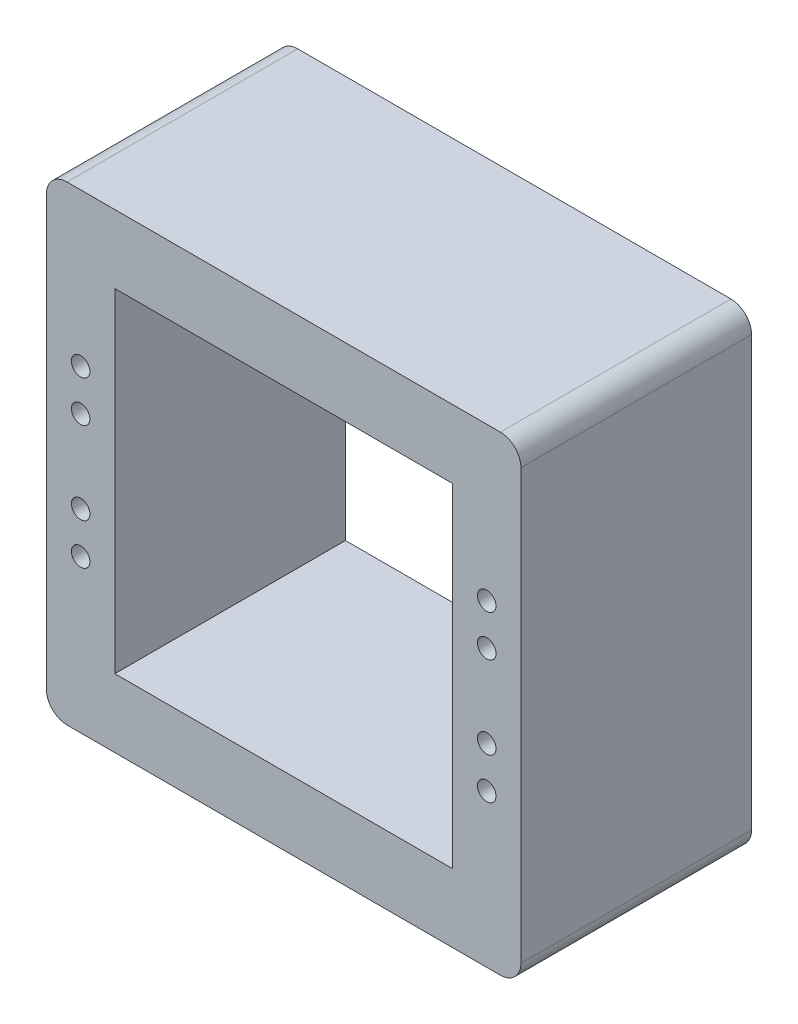
ISO-10303-21;
HEADER;
FILE_DESCRIPTION(('STEP AP214'),'2;1');
FILE_NAME('part.step','',(''),(''),'','','');
FILE_SCHEMA(('AUTOMOTIVE_DESIGN { 1 0 10303 214 1 1 1 1 }'));
ENDSEC;
DATA;
#1=APPLICATION_CONTEXT('core data for automotive mechanical design processes');
#2=APPLICATION_PROTOCOL_DEFINITION('international standard','automotive_design',2000,#1);
#3=PRODUCT_CONTEXT('',#1,'mechanical');
#4=PRODUCT('Part','Part','',(#3));
#5=PRODUCT_RELATED_PRODUCT_CATEGORY('part','',(#4));
#6=PRODUCT_DEFINITION_FORMATION('','',#4);
#7=PRODUCT_DEFINITION_CONTEXT('part definition',#1,'design');
#8=PRODUCT_DEFINITION('design','',#6,#7);
#9=PRODUCT_DEFINITION_SHAPE('','',#8);
#10=(LENGTH_UNIT() NAMED_UNIT(*) SI_UNIT(.MILLI.,.METRE.));
#11=(NAMED_UNIT(*) PLANE_ANGLE_UNIT() SI_UNIT($,.RADIAN.));
#12=(NAMED_UNIT(*) SI_UNIT($,.STERADIAN.) SOLID_ANGLE_UNIT());
#13=UNCERTAINTY_MEASURE_WITH_UNIT(LENGTH_MEASURE(1.E-05),#10,'distance_accuracy_value','');
#14=(GEOMETRIC_REPRESENTATION_CONTEXT(3) GLOBAL_UNCERTAINTY_ASSIGNED_CONTEXT((#13)) GLOBAL_UNIT_ASSIGNED_CONTEXT((#10,
#11,#12)) REPRESENTATION_CONTEXT('',''));
#15=CARTESIAN_POINT('',(0.,0.,0.));
#16=DIRECTION('',(0.,0.,1.));
#17=DIRECTION('',(1.,0.,0.));
#18=AXIS2_PLACEMENT_3D('',#15,#16,#17);
#19=CARTESIAN_POINT('',(0.,0.,28.));
#20=DIRECTION('',(0.,0.,-1.));
#21=DIRECTION('',(-1.,0.,0.));
#22=AXIS2_PLACEMENT_3D('',#19,#20,#21);
#23=PLANE('',#22);
#24=DIRECTION('',(0.,1.,0.));
#25=VECTOR('',#24,1.);
#26=CARTESIAN_POINT('',(49.3,-8.3,28.));
#27=LINE('',#26,#25);
#28=CARTESIAN_POINT('',(49.3,-5.8,28.));
#29=VERTEX_POINT('',#28);
#30=CARTESIAN_POINT('',(49.3,46.3,28.));
#31=VERTEX_POINT('',#30);
#32=EDGE_CURVE('E179',#29,#31,#27,.T.);
#33=ORIENTED_EDGE('',*,*,#32,.T.);
#34=CARTESIAN_POINT('',(46.8,46.3,28.));
#35=DIRECTION('',(0.,0.,-1.));
#36=DIRECTION('',(-1.,0.,0.));
#37=AXIS2_PLACEMENT_3D('',#34,#35,#36);
#38=CIRCLE('',#37,2.5);
#39=CARTESIAN_POINT('',(46.8,48.8,28.));
#40=VERTEX_POINT('',#39);
#41=EDGE_CURVE('E217',#31,#40,#38,.F.);
#42=ORIENTED_EDGE('',*,*,#41,.T.);
#43=DIRECTION('',(-1.,0.,0.));
#44=VECTOR('',#43,1.);
#45=CARTESIAN_POINT('',(-8.3,48.8,28.));
#46=LINE('',#45,#44);
#47=CARTESIAN_POINT('',(-5.8,48.8,28.));
#48=VERTEX_POINT('',#47);
#49=EDGE_CURVE('E182',#40,#48,#46,.T.);
#50=ORIENTED_EDGE('',*,*,#49,.T.);
#51=CARTESIAN_POINT('',(-5.8,46.3,28.));
#52=DIRECTION('',(0.,0.,-1.));
#53=DIRECTION('',(-1.,0.,0.));
#54=AXIS2_PLACEMENT_3D('',#51,#52,#53);
#55=CIRCLE('',#54,2.5);
#56=CARTESIAN_POINT('',(-8.3,46.3,28.));
#57=VERTEX_POINT('',#56);
#58=EDGE_CURVE('E212',#48,#57,#55,.F.);
#59=ORIENTED_EDGE('',*,*,#58,.T.);
#60=DIRECTION('',(0.,-1.,0.));
#61=VECTOR('',#60,1.);
#62=CARTESIAN_POINT('',(-8.3,-8.3,28.));
#63=LINE('',#62,#61);
#64=CARTESIAN_POINT('',(-8.3,-5.8,28.));
#65=VERTEX_POINT('',#64);
#66=EDGE_CURVE('E174',#57,#65,#63,.T.);
#67=ORIENTED_EDGE('',*,*,#66,.T.);
#68=CARTESIAN_POINT('',(-5.8,-5.8,28.));
#69=DIRECTION('',(0.,0.,-1.));
#70=DIRECTION('',(-1.,0.,0.));
#71=AXIS2_PLACEMENT_3D('',#68,#69,#70);
#72=CIRCLE('',#71,2.5);
#73=CARTESIAN_POINT('',(-5.8,-8.3,28.));
#74=VERTEX_POINT('',#73);
#75=EDGE_CURVE('E61',#65,#74,#72,.F.);
#76=ORIENTED_EDGE('',*,*,#75,.T.);
#77=DIRECTION('',(1.,0.,0.));
#78=VECTOR('',#77,1.);
#79=CARTESIAN_POINT('',(-8.3,-8.3,28.));
#80=LINE('',#79,#78);
#81=CARTESIAN_POINT('',(46.8,-8.3,28.));
#82=VERTEX_POINT('',#81);
#83=EDGE_CURVE('E176',#74,#82,#80,.T.);
#84=ORIENTED_EDGE('',*,*,#83,.T.);
#85=CARTESIAN_POINT('',(46.8,-5.8,28.));
#86=DIRECTION('',(0.,0.,-1.));
#87=DIRECTION('',(-1.,0.,0.));
#88=AXIS2_PLACEMENT_3D('',#85,#86,#87);
#89=CIRCLE('',#88,2.5);
#90=EDGE_CURVE('E215',#82,#29,#89,.F.);
#91=ORIENTED_EDGE('',*,*,#90,.T.);
#92=EDGE_LOOP('',(#33,#42,#50,#59,#67,#76,#84,#91));
#93=FACE_BOUND('',#92,.T.);
#94=DIRECTION('',(0.,-1.,0.));
#95=VECTOR('',#94,1.);
#96=CARTESIAN_POINT('',(0.,0.,28.));
#97=LINE('',#96,#95);
#98=CARTESIAN_POINT('',(0.,40.5,28.));
#99=VERTEX_POINT('',#98);
#100=CARTESIAN_POINT('',(0.,0.,28.));
#101=VERTEX_POINT('',#100);
#102=EDGE_CURVE('E130',#99,#101,#97,.T.);
#103=ORIENTED_EDGE('',*,*,#102,.F.);
#104=DIRECTION('',(-1.,0.,0.));
#105=VECTOR('',#104,1.);
#106=CARTESIAN_POINT('',(0.,40.5,28.));
#107=LINE('',#106,#105);
#108=CARTESIAN_POINT('',(41.,40.5,28.));
#109=VERTEX_POINT('',#108);
#110=EDGE_CURVE('E156',#109,#99,#107,.T.);
#111=ORIENTED_EDGE('',*,*,#110,.F.);
#112=DIRECTION('',(0.,1.,0.));
#113=VECTOR('',#112,1.);
#114=CARTESIAN_POINT('',(41.,0.,28.));
#115=LINE('',#114,#113);
#116=CARTESIAN_POINT('',(41.,0.,28.));
#117=VERTEX_POINT('',#116);
#118=EDGE_CURVE('E154',#117,#109,#115,.T.);
#119=ORIENTED_EDGE('',*,*,#118,.F.);
#120=DIRECTION('',(1.,0.,0.));
#121=VECTOR('',#120,1.);
#122=CARTESIAN_POINT('',(0.,0.,28.));
#123=LINE('',#122,#121);
#124=EDGE_CURVE('E140',#101,#117,#123,.T.);
#125=ORIENTED_EDGE('',*,*,#124,.F.);
#126=EDGE_LOOP('',(#103,#111,#119,#125));
#127=FACE_BOUND('',#126,.T.);
#128=CARTESIAN_POINT('',(-4.15,25.25,28.));
#129=DIRECTION('',(0.,0.,1.));
#130=DIRECTION('',(1.,0.,0.));
#131=AXIS2_PLACEMENT_3D('',#128,#129,#130);
#132=CIRCLE('',#131,1.125);
#133=CARTESIAN_POINT('',(-3.025,25.25,28.));
#134=VERTEX_POINT('',#133);
#135=EDGE_CURVE('E163',#134,#134,#132,.T.);
#136=ORIENTED_EDGE('',*,*,#135,.F.);
#137=EDGE_LOOP('',(#136));
#138=FACE_BOUND('',#137,.T.);
#139=CARTESIAN_POINT('',(-4.15,30.25,28.));
#140=DIRECTION('',(0.,0.,1.));
#141=DIRECTION('',(1.,0.,0.));
#142=AXIS2_PLACEMENT_3D('',#139,#140,#141);
#143=CIRCLE('',#142,1.125);
#144=CARTESIAN_POINT('',(-3.025,30.25,28.));
#145=VERTEX_POINT('',#144);
#146=EDGE_CURVE('E502',#145,#145,#143,.T.);
#147=ORIENTED_EDGE('',*,*,#146,.F.);
#148=EDGE_LOOP('',(#147));
#149=FACE_BOUND('',#148,.T.);
#150=CARTESIAN_POINT('',(-4.15000000000001,10.25,28.));
#151=DIRECTION('',(0.,0.,1.));
#152=DIRECTION('',(-1.,0.,0.));
#153=AXIS2_PLACEMENT_3D('',#150,#151,#152);
#154=CIRCLE('',#153,1.125);
#155=CARTESIAN_POINT('',(-5.275,10.25,28.));
#156=VERTEX_POINT('',#155);
#157=EDGE_CURVE('E497',#156,#156,#154,.T.);
#158=ORIENTED_EDGE('',*,*,#157,.F.);
#159=EDGE_LOOP('',(#158));
#160=FACE_BOUND('',#159,.T.);
#161=CARTESIAN_POINT('',(-4.15,15.25,28.));
#162=DIRECTION('',(0.,0.,1.));
#163=DIRECTION('',(-1.,0.,0.));
#164=AXIS2_PLACEMENT_3D('',#161,#162,#163);
#165=CIRCLE('',#164,1.125);
#166=CARTESIAN_POINT('',(-5.275,15.25,28.));
#167=VERTEX_POINT('',#166);
#168=EDGE_CURVE('E492',#167,#167,#165,.T.);
#169=ORIENTED_EDGE('',*,*,#168,.F.);
#170=EDGE_LOOP('',(#169));
#171=FACE_BOUND('',#170,.T.);
#172=CARTESIAN_POINT('',(45.15,15.25,28.));
#173=DIRECTION('',(0.,0.,1.));
#174=DIRECTION('',(1.,0.,0.));
#175=AXIS2_PLACEMENT_3D('',#172,#173,#174);
#176=CIRCLE('',#175,1.125);
#177=CARTESIAN_POINT('',(46.275,15.25,28.));
#178=VERTEX_POINT('',#177);
#179=EDGE_CURVE('E487',#178,#178,#176,.T.);
#180=ORIENTED_EDGE('',*,*,#179,.F.);
#181=EDGE_LOOP('',(#180));
#182=FACE_BOUND('',#181,.T.);
#183=CARTESIAN_POINT('',(45.15,10.25,28.));
#184=DIRECTION('',(0.,0.,1.));
#185=DIRECTION('',(1.,0.,0.));
#186=AXIS2_PLACEMENT_3D('',#183,#184,#185);
#187=CIRCLE('',#186,1.12499999999999);
#188=CARTESIAN_POINT('',(46.275,10.25,28.));
#189=VERTEX_POINT('',#188);
#190=EDGE_CURVE('E482',#189,#189,#187,.T.);
#191=ORIENTED_EDGE('',*,*,#190,.F.);
#192=EDGE_LOOP('',(#191));
#193=FACE_BOUND('',#192,.T.);
#194=CARTESIAN_POINT('',(45.15,30.25,28.));
#195=DIRECTION('',(0.,0.,1.));
#196=DIRECTION('',(-1.,0.,0.));
#197=AXIS2_PLACEMENT_3D('',#194,#195,#196);
#198=CIRCLE('',#197,1.125);
#199=CARTESIAN_POINT('',(44.025,30.25,28.));
#200=VERTEX_POINT('',#199);
#201=EDGE_CURVE('E477',#200,#200,#198,.T.);
#202=ORIENTED_EDGE('',*,*,#201,.F.);
#203=EDGE_LOOP('',(#202));
#204=FACE_BOUND('',#203,.T.);
#205=CARTESIAN_POINT('',(45.15,25.25,28.));
#206=DIRECTION('',(0.,0.,1.));
#207=DIRECTION('',(-1.,0.,0.));
#208=AXIS2_PLACEMENT_3D('',#205,#206,#207);
#209=CIRCLE('',#208,1.125);
#210=CARTESIAN_POINT('',(44.025,25.25,28.));
#211=VERTEX_POINT('',#210);
#212=EDGE_CURVE('E471',#211,#211,#209,.T.);
#213=ORIENTED_EDGE('',*,*,#212,.F.);
#214=EDGE_LOOP('',(#213));
#215=FACE_BOUND('',#214,.T.);
#216=ADVANCED_FACE('F39',(#93,#127,#138,#149,#160,#171,#182,#193,#204,#215),#23,.F.);
#217=CARTESIAN_POINT('',(0.,0.,0.));
#218=DIRECTION('',(0.,0.,-1.));
#219=DIRECTION('',(-1.,0.,0.));
#220=AXIS2_PLACEMENT_3D('',#217,#218,#219);
#221=PLANE('',#220);
#222=CARTESIAN_POINT('',(45.15,30.25,0.));
#223=DIRECTION('',(0.,0.,1.));
#224=DIRECTION('',(-1.,0.,0.));
#225=AXIS2_PLACEMENT_3D('',#222,#223,#224);
#226=CIRCLE('',#225,1.125);
#227=CARTESIAN_POINT('',(44.025,30.25,0.));
#228=VERTEX_POINT('',#227);
#229=EDGE_CURVE('E474',#228,#228,#226,.T.);
#230=ORIENTED_EDGE('',*,*,#229,.T.);
#231=EDGE_LOOP('',(#230));
#232=FACE_BOUND('',#231,.T.);
#233=CARTESIAN_POINT('',(45.15,15.25,0.));
#234=DIRECTION('',(0.,0.,1.));
#235=DIRECTION('',(1.,0.,0.));
#236=AXIS2_PLACEMENT_3D('',#233,#234,#235);
#237=CIRCLE('',#236,1.125);
#238=CARTESIAN_POINT('',(46.275,15.25,0.));
#239=VERTEX_POINT('',#238);
#240=EDGE_CURVE('E485',#239,#239,#237,.T.);
#241=ORIENTED_EDGE('',*,*,#240,.T.);
#242=EDGE_LOOP('',(#241));
#243=FACE_BOUND('',#242,.T.);
#244=CARTESIAN_POINT('',(-4.15000000000001,10.25,0.));
#245=DIRECTION('',(0.,0.,1.));
#246=DIRECTION('',(-1.,0.,0.));
#247=AXIS2_PLACEMENT_3D('',#244,#245,#246);
#248=CIRCLE('',#247,1.125);
#249=CARTESIAN_POINT('',(-5.275,10.25,0.));
#250=VERTEX_POINT('',#249);
#251=EDGE_CURVE('E495',#250,#250,#248,.T.);
#252=ORIENTED_EDGE('',*,*,#251,.T.);
#253=EDGE_LOOP('',(#252));
#254=FACE_BOUND('',#253,.T.);
#255=CARTESIAN_POINT('',(-4.15,25.25,0.));
#256=DIRECTION('',(0.,0.,1.));
#257=DIRECTION('',(1.,0.,0.));
#258=AXIS2_PLACEMENT_3D('',#255,#256,#257);
#259=CIRCLE('',#258,1.125);
#260=CARTESIAN_POINT('',(-3.025,25.25,0.));
#261=VERTEX_POINT('',#260);
#262=EDGE_CURVE('E505',#261,#261,#259,.T.);
#263=ORIENTED_EDGE('',*,*,#262,.T.);
#264=EDGE_LOOP('',(#263));
#265=FACE_BOUND('',#264,.T.);
#266=DIRECTION('',(-1.,0.,0.));
#267=VECTOR('',#266,1.);
#268=CARTESIAN_POINT('',(-8.3,48.8,0.));
#269=LINE('',#268,#267);
#270=CARTESIAN_POINT('',(46.8,48.8,0.));
#271=VERTEX_POINT('',#270);
#272=CARTESIAN_POINT('',(-5.8,48.8,0.));
#273=VERTEX_POINT('',#272);
#274=EDGE_CURVE('E177',#271,#273,#269,.T.);
#275=ORIENTED_EDGE('',*,*,#274,.F.);
#276=CARTESIAN_POINT('',(46.8,46.3,0.));
#277=DIRECTION('',(0.,0.,-1.));
#278=DIRECTION('',(-1.,0.,0.));
#279=AXIS2_PLACEMENT_3D('',#276,#277,#278);
#280=CIRCLE('',#279,2.5);
#281=CARTESIAN_POINT('',(49.3,46.3,0.));
#282=VERTEX_POINT('',#281);
#283=EDGE_CURVE('E205',#271,#282,#280,.T.);
#284=ORIENTED_EDGE('',*,*,#283,.T.);
#285=DIRECTION('',(0.,1.,0.));
#286=VECTOR('',#285,1.);
#287=CARTESIAN_POINT('',(49.3,-8.3,0.));
#288=LINE('',#287,#286);
#289=CARTESIAN_POINT('',(49.3,-5.8,0.));
#290=VERTEX_POINT('',#289);
#291=EDGE_CURVE('E190',#290,#282,#288,.T.);
#292=ORIENTED_EDGE('',*,*,#291,.F.);
#293=CARTESIAN_POINT('',(46.8,-5.8,0.));
#294=DIRECTION('',(0.,0.,-1.));
#295=DIRECTION('',(-1.,0.,0.));
#296=AXIS2_PLACEMENT_3D('',#293,#294,#295);
#297=CIRCLE('',#296,2.5);
#298=CARTESIAN_POINT('',(46.8,-8.3,0.));
#299=VERTEX_POINT('',#298);
#300=EDGE_CURVE('E203',#290,#299,#297,.T.);
#301=ORIENTED_EDGE('',*,*,#300,.T.);
#302=DIRECTION('',(1.,0.,0.));
#303=VECTOR('',#302,1.);
#304=CARTESIAN_POINT('',(-8.3,-8.3,0.));
#305=LINE('',#304,#303);
#306=CARTESIAN_POINT('',(-5.8,-8.3,0.));
#307=VERTEX_POINT('',#306);
#308=EDGE_CURVE('E188',#307,#299,#305,.T.);
#309=ORIENTED_EDGE('',*,*,#308,.F.);
#310=CARTESIAN_POINT('',(-5.8,-5.8,0.));
#311=DIRECTION('',(0.,0.,-1.));
#312=DIRECTION('',(-1.,0.,0.));
#313=AXIS2_PLACEMENT_3D('',#310,#311,#312);
#314=CIRCLE('',#313,2.5);
#315=CARTESIAN_POINT('',(-8.3,-5.8,0.));
#316=VERTEX_POINT('',#315);
#317=EDGE_CURVE('E201',#307,#316,#314,.T.);
#318=ORIENTED_EDGE('',*,*,#317,.T.);
#319=DIRECTION('',(0.,-1.,0.));
#320=VECTOR('',#319,1.);
#321=CARTESIAN_POINT('',(-8.3,-8.3,0.));
#322=LINE('',#321,#320);
#323=CARTESIAN_POINT('',(-8.3,46.3,0.));
#324=VERTEX_POINT('',#323);
#325=EDGE_CURVE('E148',#324,#316,#322,.T.);
#326=ORIENTED_EDGE('',*,*,#325,.F.);
#327=CARTESIAN_POINT('',(-5.8,46.3,0.));
#328=DIRECTION('',(0.,0.,-1.));
#329=DIRECTION('',(-1.,0.,0.));
#330=AXIS2_PLACEMENT_3D('',#327,#328,#329);
#331=CIRCLE('',#330,2.5);
#332=EDGE_CURVE('E199',#324,#273,#331,.T.);
#333=ORIENTED_EDGE('',*,*,#332,.T.);
#334=EDGE_LOOP('',(#275,#284,#292,#301,#309,#318,#326,#333));
#335=FACE_BOUND('',#334,.T.);
#336=DIRECTION('',(-1.,0.,0.));
#337=VECTOR('',#336,1.);
#338=CARTESIAN_POINT('',(0.,40.5,0.));
#339=LINE('',#338,#337);
#340=CARTESIAN_POINT('',(41.,40.5,0.));
#341=VERTEX_POINT('',#340);
#342=CARTESIAN_POINT('',(0.,40.5,0.));
#343=VERTEX_POINT('',#342);
#344=EDGE_CURVE('E141',#341,#343,#339,.T.);
#345=ORIENTED_EDGE('',*,*,#344,.T.);
#346=DIRECTION('',(0.,-1.,0.));
#347=VECTOR('',#346,1.);
#348=CARTESIAN_POINT('',(0.,0.,0.));
#349=LINE('',#348,#347);
#350=CARTESIAN_POINT('',(0.,0.,0.));
#351=VERTEX_POINT('',#350);
#352=EDGE_CURVE('E161',#343,#351,#349,.T.);
#353=ORIENTED_EDGE('',*,*,#352,.T.);
#354=DIRECTION('',(1.,0.,0.));
#355=VECTOR('',#354,1.);
#356=CARTESIAN_POINT('',(0.,0.,0.));
#357=LINE('',#356,#355);
#358=CARTESIAN_POINT('',(41.,0.,0.));
#359=VERTEX_POINT('',#358);
#360=EDGE_CURVE('E147',#351,#359,#357,.T.);
#361=ORIENTED_EDGE('',*,*,#360,.T.);
#362=DIRECTION('',(0.,1.,0.));
#363=VECTOR('',#362,1.);
#364=CARTESIAN_POINT('',(41.,0.,0.));
#365=LINE('',#364,#363);
#366=EDGE_CURVE('E165',#359,#341,#365,.T.);
#367=ORIENTED_EDGE('',*,*,#366,.T.);
#368=EDGE_LOOP('',(#345,#353,#361,#367));
#369=FACE_BOUND('',#368,.T.);
#370=CARTESIAN_POINT('',(-4.15,30.25,0.));
#371=DIRECTION('',(0.,0.,1.));
#372=DIRECTION('',(1.,0.,0.));
#373=AXIS2_PLACEMENT_3D('',#370,#371,#372);
#374=CIRCLE('',#373,1.125);
#375=CARTESIAN_POINT('',(-3.025,30.25,0.));
#376=VERTEX_POINT('',#375);
#377=EDGE_CURVE('E458',#376,#376,#374,.T.);
#378=ORIENTED_EDGE('',*,*,#377,.T.);
#379=EDGE_LOOP('',(#378));
#380=FACE_BOUND('',#379,.T.);
#381=CARTESIAN_POINT('',(-4.15,15.25,0.));
#382=DIRECTION('',(0.,0.,1.));
#383=DIRECTION('',(-1.,0.,0.));
#384=AXIS2_PLACEMENT_3D('',#381,#382,#383);
#385=CIRCLE('',#384,1.125);
#386=CARTESIAN_POINT('',(-5.275,15.25,0.));
#387=VERTEX_POINT('',#386);
#388=EDGE_CURVE('E462',#387,#387,#385,.T.);
#389=ORIENTED_EDGE('',*,*,#388,.T.);
#390=EDGE_LOOP('',(#389));
#391=FACE_BOUND('',#390,.T.);
#392=CARTESIAN_POINT('',(45.15,10.25,0.));
#393=DIRECTION('',(0.,0.,1.));
#394=DIRECTION('',(1.,0.,0.));
#395=AXIS2_PLACEMENT_3D('',#392,#393,#394);
#396=CIRCLE('',#395,1.12499999999999);
#397=CARTESIAN_POINT('',(46.275,10.25,0.));
#398=VERTEX_POINT('',#397);
#399=EDGE_CURVE('E466',#398,#398,#396,.T.);
#400=ORIENTED_EDGE('',*,*,#399,.T.);
#401=EDGE_LOOP('',(#400));
#402=FACE_BOUND('',#401,.T.);
#403=CARTESIAN_POINT('',(45.15,25.25,0.));
#404=DIRECTION('',(0.,0.,1.));
#405=DIRECTION('',(-1.,0.,0.));
#406=AXIS2_PLACEMENT_3D('',#403,#404,#405);
#407=CIRCLE('',#406,1.125);
#408=CARTESIAN_POINT('',(44.025,25.25,0.));
#409=VERTEX_POINT('',#408);
#410=EDGE_CURVE('E469',#409,#409,#407,.T.);
#411=ORIENTED_EDGE('',*,*,#410,.T.);
#412=EDGE_LOOP('',(#411));
#413=FACE_BOUND('',#412,.T.);
#414=ADVANCED_FACE('F233',(#232,#243,#254,#265,#335,#369,#380,#391,#402,#413),#221,.T.);
#415=CARTESIAN_POINT('',(-8.3,-8.3,28.));
#416=DIRECTION('',(1.,0.,0.));
#417=DIRECTION('',(0.,0.,-1.));
#418=AXIS2_PLACEMENT_3D('',#415,#416,#417);
#419=PLANE('',#418);
#420=ORIENTED_EDGE('',*,*,#325,.T.);
#421=DIRECTION('',(0.,0.,-1.));
#422=VECTOR('',#421,1.);
#423=CARTESIAN_POINT('',(-8.3,-5.8,28.));
#424=LINE('',#423,#422);
#425=EDGE_CURVE('E11',#316,#65,#424,.F.);
#426=ORIENTED_EDGE('',*,*,#425,.T.);
#427=ORIENTED_EDGE('',*,*,#66,.F.);
#428=DIRECTION('',(0.,0.,-1.));
#429=VECTOR('',#428,1.);
#430=CARTESIAN_POINT('',(-8.3,46.3,28.));
#431=LINE('',#430,#429);
#432=EDGE_CURVE('E47',#57,#324,#431,.T.);
#433=ORIENTED_EDGE('',*,*,#432,.T.);
#434=EDGE_LOOP('',(#420,#426,#427,#433));
#435=FACE_BOUND('',#434,.T.);
#436=ADVANCED_FACE('F227',(#435),#419,.F.);
#437=CARTESIAN_POINT('',(-8.3,-8.3,28.));
#438=DIRECTION('',(0.,1.,0.));
#439=DIRECTION('',(0.,0.,1.));
#440=AXIS2_PLACEMENT_3D('',#437,#438,#439);
#441=PLANE('',#440);
#442=ORIENTED_EDGE('',*,*,#308,.T.);
#443=DIRECTION('',(0.,0.,-1.));
#444=VECTOR('',#443,1.);
#445=CARTESIAN_POINT('',(46.8,-8.3,28.));
#446=LINE('',#445,#444);
#447=EDGE_CURVE('E54',#299,#82,#446,.F.);
#448=ORIENTED_EDGE('',*,*,#447,.T.);
#449=ORIENTED_EDGE('',*,*,#83,.F.);
#450=DIRECTION('',(0.,0.,-1.));
#451=VECTOR('',#450,1.);
#452=CARTESIAN_POINT('',(-5.8,-8.3,28.));
#453=LINE('',#452,#451);
#454=EDGE_CURVE('E219',#74,#307,#453,.T.);
#455=ORIENTED_EDGE('',*,*,#454,.T.);
#456=EDGE_LOOP('',(#442,#448,#449,#455));
#457=FACE_BOUND('',#456,.T.);
#458=ADVANCED_FACE('F239',(#457),#441,.F.);
#459=CARTESIAN_POINT('',(49.3,-8.3,28.));
#460=DIRECTION('',(-1.,0.,0.));
#461=DIRECTION('',(0.,0.,1.));
#462=AXIS2_PLACEMENT_3D('',#459,#460,#461);
#463=PLANE('',#462);
#464=ORIENTED_EDGE('',*,*,#291,.T.);
#465=DIRECTION('',(0.,0.,-1.));
#466=VECTOR('',#465,1.);
#467=CARTESIAN_POINT('',(49.3,46.3,28.));
#468=LINE('',#467,#466);
#469=EDGE_CURVE('E210',#282,#31,#468,.F.);
#470=ORIENTED_EDGE('',*,*,#469,.T.);
#471=ORIENTED_EDGE('',*,*,#32,.F.);
#472=DIRECTION('',(0.,0.,-1.));
#473=VECTOR('',#472,1.);
#474=CARTESIAN_POINT('',(49.3,-5.8,28.));
#475=LINE('',#474,#473);
#476=EDGE_CURVE('E207',#29,#290,#475,.T.);
#477=ORIENTED_EDGE('',*,*,#476,.T.);
#478=EDGE_LOOP('',(#464,#470,#471,#477));
#479=FACE_BOUND('',#478,.T.);
#480=ADVANCED_FACE('F247',(#479),#463,.F.);
#481=CARTESIAN_POINT('',(-8.3,48.8,28.));
#482=DIRECTION('',(0.,-1.,0.));
#483=DIRECTION('',(0.,0.,-1.));
#484=AXIS2_PLACEMENT_3D('',#481,#482,#483);
#485=PLANE('',#484);
#486=ORIENTED_EDGE('',*,*,#49,.F.);
#487=DIRECTION('',(0.,0.,-1.));
#488=VECTOR('',#487,1.);
#489=CARTESIAN_POINT('',(46.8,48.8,28.));
#490=LINE('',#489,#488);
#491=EDGE_CURVE('E196',#40,#271,#490,.T.);
#492=ORIENTED_EDGE('',*,*,#491,.T.);
#493=ORIENTED_EDGE('',*,*,#274,.T.);
#494=DIRECTION('',(0.,0.,-1.));
#495=VECTOR('',#494,1.);
#496=CARTESIAN_POINT('',(-5.8,48.8,28.));
#497=LINE('',#496,#495);
#498=EDGE_CURVE('E185',#273,#48,#497,.F.);
#499=ORIENTED_EDGE('',*,*,#498,.T.);
#500=EDGE_LOOP('',(#486,#492,#493,#499));
#501=FACE_BOUND('',#500,.T.);
#502=ADVANCED_FACE('F255',(#501),#485,.F.);
#503=CARTESIAN_POINT('',(0.,0.,28.));
#504=DIRECTION('',(1.,0.,0.));
#505=DIRECTION('',(0.,0.,-1.));
#506=AXIS2_PLACEMENT_3D('',#503,#504,#505);
#507=PLANE('',#506);
#508=ORIENTED_EDGE('',*,*,#352,.F.);
#509=DIRECTION('',(0.,0.,-1.));
#510=VECTOR('',#509,1.);
#511=CARTESIAN_POINT('',(0.,40.5,28.));
#512=LINE('',#511,#510);
#513=EDGE_CURVE('E136',#99,#343,#512,.T.);
#514=ORIENTED_EDGE('',*,*,#513,.F.);
#515=ORIENTED_EDGE('',*,*,#102,.T.);
#516=DIRECTION('',(0.,0.,-1.));
#517=VECTOR('',#516,1.);
#518=CARTESIAN_POINT('',(0.,0.,28.));
#519=LINE('',#518,#517);
#520=EDGE_CURVE('E133',#101,#351,#519,.T.);
#521=ORIENTED_EDGE('',*,*,#520,.T.);
#522=EDGE_LOOP('',(#508,#514,#515,#521));
#523=FACE_BOUND('',#522,.T.);
#524=ADVANCED_FACE('F132',(#523),#507,.T.);
#525=CARTESIAN_POINT('',(0.,0.,28.));
#526=DIRECTION('',(0.,1.,0.));
#527=DIRECTION('',(0.,0.,1.));
#528=AXIS2_PLACEMENT_3D('',#525,#526,#527);
#529=PLANE('',#528);
#530=ORIENTED_EDGE('',*,*,#360,.F.);
#531=ORIENTED_EDGE('',*,*,#520,.F.);
#532=ORIENTED_EDGE('',*,*,#124,.T.);
#533=DIRECTION('',(0.,0.,-1.));
#534=VECTOR('',#533,1.);
#535=CARTESIAN_POINT('',(41.,0.,28.));
#536=LINE('',#535,#534);
#537=EDGE_CURVE('E149',#117,#359,#536,.T.);
#538=ORIENTED_EDGE('',*,*,#537,.T.);
#539=EDGE_LOOP('',(#530,#531,#532,#538));
#540=FACE_BOUND('',#539,.T.);
#541=ADVANCED_FACE('F144',(#540),#529,.T.);
#542=CARTESIAN_POINT('',(41.,0.,28.));
#543=DIRECTION('',(-1.,0.,0.));
#544=DIRECTION('',(0.,0.,1.));
#545=AXIS2_PLACEMENT_3D('',#542,#543,#544);
#546=PLANE('',#545);
#547=ORIENTED_EDGE('',*,*,#366,.F.);
#548=ORIENTED_EDGE('',*,*,#537,.F.);
#549=ORIENTED_EDGE('',*,*,#118,.T.);
#550=DIRECTION('',(0.,0.,-1.));
#551=VECTOR('',#550,1.);
#552=CARTESIAN_POINT('',(41.,40.5,28.));
#553=LINE('',#552,#551);
#554=EDGE_CURVE('E171',#109,#341,#553,.T.);
#555=ORIENTED_EDGE('',*,*,#554,.T.);
#556=EDGE_LOOP('',(#547,#548,#549,#555));
#557=FACE_BOUND('',#556,.T.);
#558=ADVANCED_FACE('F382',(#557),#546,.T.);
#559=CARTESIAN_POINT('',(0.,40.5,28.));
#560=DIRECTION('',(0.,-1.,0.));
#561=DIRECTION('',(0.,0.,-1.));
#562=AXIS2_PLACEMENT_3D('',#559,#560,#561);
#563=PLANE('',#562);
#564=ORIENTED_EDGE('',*,*,#344,.F.);
#565=ORIENTED_EDGE('',*,*,#554,.F.);
#566=ORIENTED_EDGE('',*,*,#110,.T.);
#567=ORIENTED_EDGE('',*,*,#513,.T.);
#568=EDGE_LOOP('',(#564,#565,#566,#567));
#569=FACE_BOUND('',#568,.T.);
#570=ADVANCED_FACE('F373',(#569),#563,.T.);
#571=CARTESIAN_POINT('',(-4.15,25.25,28.));
#572=DIRECTION('',(0.,0.,-1.));
#573=DIRECTION('',(-1.,0.,0.));
#574=AXIS2_PLACEMENT_3D('',#571,#572,#573);
#575=CYLINDRICAL_SURFACE('',#574,1.125);
#576=ORIENTED_EDGE('',*,*,#135,.T.);
#577=EDGE_LOOP('',(#576));
#578=FACE_BOUND('',#577,.T.);
#579=ORIENTED_EDGE('',*,*,#262,.F.);
#580=EDGE_LOOP('',(#579));
#581=FACE_BOUND('',#580,.T.);
#582=ADVANCED_FACE('F364',(#578,#581),#575,.F.);
#583=CARTESIAN_POINT('',(-4.15,30.25,28.));
#584=DIRECTION('',(0.,0.,-1.));
#585=DIRECTION('',(-1.,0.,0.));
#586=AXIS2_PLACEMENT_3D('',#583,#584,#585);
#587=CYLINDRICAL_SURFACE('',#586,1.125);
#588=ORIENTED_EDGE('',*,*,#146,.T.);
#589=EDGE_LOOP('',(#588));
#590=FACE_BOUND('',#589,.T.);
#591=ORIENTED_EDGE('',*,*,#377,.F.);
#592=EDGE_LOOP('',(#591));
#593=FACE_BOUND('',#592,.T.);
#594=ADVANCED_FACE('F355',(#590,#593),#587,.F.);
#595=CARTESIAN_POINT('',(-4.15000000000001,10.25,28.));
#596=DIRECTION('',(0.,0.,-1.));
#597=DIRECTION('',(-1.,0.,0.));
#598=AXIS2_PLACEMENT_3D('',#595,#596,#597);
#599=CYLINDRICAL_SURFACE('',#598,1.125);
#600=ORIENTED_EDGE('',*,*,#157,.T.);
#601=EDGE_LOOP('',(#600));
#602=FACE_BOUND('',#601,.T.);
#603=ORIENTED_EDGE('',*,*,#251,.F.);
#604=EDGE_LOOP('',(#603));
#605=FACE_BOUND('',#604,.T.);
#606=ADVANCED_FACE('F346',(#602,#605),#599,.F.);
#607=CARTESIAN_POINT('',(-4.15,15.25,28.));
#608=DIRECTION('',(0.,0.,-1.));
#609=DIRECTION('',(-1.,0.,0.));
#610=AXIS2_PLACEMENT_3D('',#607,#608,#609);
#611=CYLINDRICAL_SURFACE('',#610,1.125);
#612=ORIENTED_EDGE('',*,*,#168,.T.);
#613=EDGE_LOOP('',(#612));
#614=FACE_BOUND('',#613,.T.);
#615=ORIENTED_EDGE('',*,*,#388,.F.);
#616=EDGE_LOOP('',(#615));
#617=FACE_BOUND('',#616,.T.);
#618=ADVANCED_FACE('F337',(#614,#617),#611,.F.);
#619=CARTESIAN_POINT('',(45.15,15.25,28.));
#620=DIRECTION('',(0.,0.,-1.));
#621=DIRECTION('',(-1.,0.,0.));
#622=AXIS2_PLACEMENT_3D('',#619,#620,#621);
#623=CYLINDRICAL_SURFACE('',#622,1.125);
#624=ORIENTED_EDGE('',*,*,#179,.T.);
#625=EDGE_LOOP('',(#624));
#626=FACE_BOUND('',#625,.T.);
#627=ORIENTED_EDGE('',*,*,#240,.F.);
#628=EDGE_LOOP('',(#627));
#629=FACE_BOUND('',#628,.T.);
#630=ADVANCED_FACE('F328',(#626,#629),#623,.F.);
#631=CARTESIAN_POINT('',(45.15,10.25,28.));
#632=DIRECTION('',(0.,0.,-1.));
#633=DIRECTION('',(-1.,0.,0.));
#634=AXIS2_PLACEMENT_3D('',#631,#632,#633);
#635=CYLINDRICAL_SURFACE('',#634,1.12499999999999);
#636=ORIENTED_EDGE('',*,*,#190,.T.);
#637=EDGE_LOOP('',(#636));
#638=FACE_BOUND('',#637,.T.);
#639=ORIENTED_EDGE('',*,*,#399,.F.);
#640=EDGE_LOOP('',(#639));
#641=FACE_BOUND('',#640,.T.);
#642=ADVANCED_FACE('F319',(#638,#641),#635,.F.);
#643=CARTESIAN_POINT('',(45.15,30.25,28.));
#644=DIRECTION('',(0.,0.,-1.));
#645=DIRECTION('',(-1.,0.,0.));
#646=AXIS2_PLACEMENT_3D('',#643,#644,#645);
#647=CYLINDRICAL_SURFACE('',#646,1.125);
#648=ORIENTED_EDGE('',*,*,#201,.T.);
#649=EDGE_LOOP('',(#648));
#650=FACE_BOUND('',#649,.T.);
#651=ORIENTED_EDGE('',*,*,#229,.F.);
#652=EDGE_LOOP('',(#651));
#653=FACE_BOUND('',#652,.T.);
#654=ADVANCED_FACE('F310',(#650,#653),#647,.F.);
#655=CARTESIAN_POINT('',(45.15,25.25,28.));
#656=DIRECTION('',(0.,0.,-1.));
#657=DIRECTION('',(-1.,0.,0.));
#658=AXIS2_PLACEMENT_3D('',#655,#656,#657);
#659=CYLINDRICAL_SURFACE('',#658,1.125);
#660=ORIENTED_EDGE('',*,*,#212,.T.);
#661=EDGE_LOOP('',(#660));
#662=FACE_BOUND('',#661,.T.);
#663=ORIENTED_EDGE('',*,*,#410,.F.);
#664=EDGE_LOOP('',(#663));
#665=FACE_BOUND('',#664,.T.);
#666=ADVANCED_FACE('F282',(#662,#665),#659,.F.);
#667=CARTESIAN_POINT('',(46.8,46.3,28.));
#668=DIRECTION('',(0.,0.,-1.));
#669=DIRECTION('',(-1.,0.,0.));
#670=AXIS2_PLACEMENT_3D('',#667,#668,#669);
#671=CYLINDRICAL_SURFACE('',#670,2.5);
#672=ORIENTED_EDGE('',*,*,#41,.F.);
#673=ORIENTED_EDGE('',*,*,#469,.F.);
#674=ORIENTED_EDGE('',*,*,#283,.F.);
#675=ORIENTED_EDGE('',*,*,#491,.F.);
#676=EDGE_LOOP('',(#672,#673,#674,#675));
#677=FACE_BOUND('',#676,.T.);
#678=ADVANCED_FACE('F252',(#677),#671,.T.);
#679=CARTESIAN_POINT('',(46.8,-5.8,28.));
#680=DIRECTION('',(0.,0.,-1.));
#681=DIRECTION('',(-1.,0.,0.));
#682=AXIS2_PLACEMENT_3D('',#679,#680,#681);
#683=CYLINDRICAL_SURFACE('',#682,2.5);
#684=ORIENTED_EDGE('',*,*,#90,.F.);
#685=ORIENTED_EDGE('',*,*,#447,.F.);
#686=ORIENTED_EDGE('',*,*,#300,.F.);
#687=ORIENTED_EDGE('',*,*,#476,.F.);
#688=EDGE_LOOP('',(#684,#685,#686,#687));
#689=FACE_BOUND('',#688,.T.);
#690=ADVANCED_FACE('F244',(#689),#683,.T.);
#691=CARTESIAN_POINT('',(-5.8,-5.8,28.));
#692=DIRECTION('',(0.,0.,-1.));
#693=DIRECTION('',(-1.,0.,0.));
#694=AXIS2_PLACEMENT_3D('',#691,#692,#693);
#695=CYLINDRICAL_SURFACE('',#694,2.5);
#696=ORIENTED_EDGE('',*,*,#75,.F.);
#697=ORIENTED_EDGE('',*,*,#425,.F.);
#698=ORIENTED_EDGE('',*,*,#317,.F.);
#699=ORIENTED_EDGE('',*,*,#454,.F.);
#700=EDGE_LOOP('',(#696,#697,#698,#699));
#701=FACE_BOUND('',#700,.T.);
#702=ADVANCED_FACE('F238',(#701),#695,.T.);
#703=CARTESIAN_POINT('',(-5.8,46.3,28.));
#704=DIRECTION('',(0.,0.,-1.));
#705=DIRECTION('',(-1.,0.,0.));
#706=AXIS2_PLACEMENT_3D('',#703,#704,#705);
#707=CYLINDRICAL_SURFACE('',#706,2.5);
#708=ORIENTED_EDGE('',*,*,#58,.F.);
#709=ORIENTED_EDGE('',*,*,#498,.F.);
#710=ORIENTED_EDGE('',*,*,#332,.F.);
#711=ORIENTED_EDGE('',*,*,#432,.F.);
#712=EDGE_LOOP('',(#708,#709,#710,#711));
#713=FACE_BOUND('',#712,.T.);
#714=ADVANCED_FACE('F41',(#713),#707,.T.);
#715=CLOSED_SHELL('',(#216,#414,#436,#458,#480,#502,#524,#541,#558,#570,#582,#594,#606,#618,
#630,#642,#654,#666,#678,#690,#702,#714));
#716=MANIFOLD_SOLID_BREP('B2',#715);
#717=ADVANCED_BREP_SHAPE_REPRESENTATION('',(#18,#716),#14);
#718=SHAPE_DEFINITION_REPRESENTATION(#9,#717);
ENDSEC;
END-ISO-10303-21;
